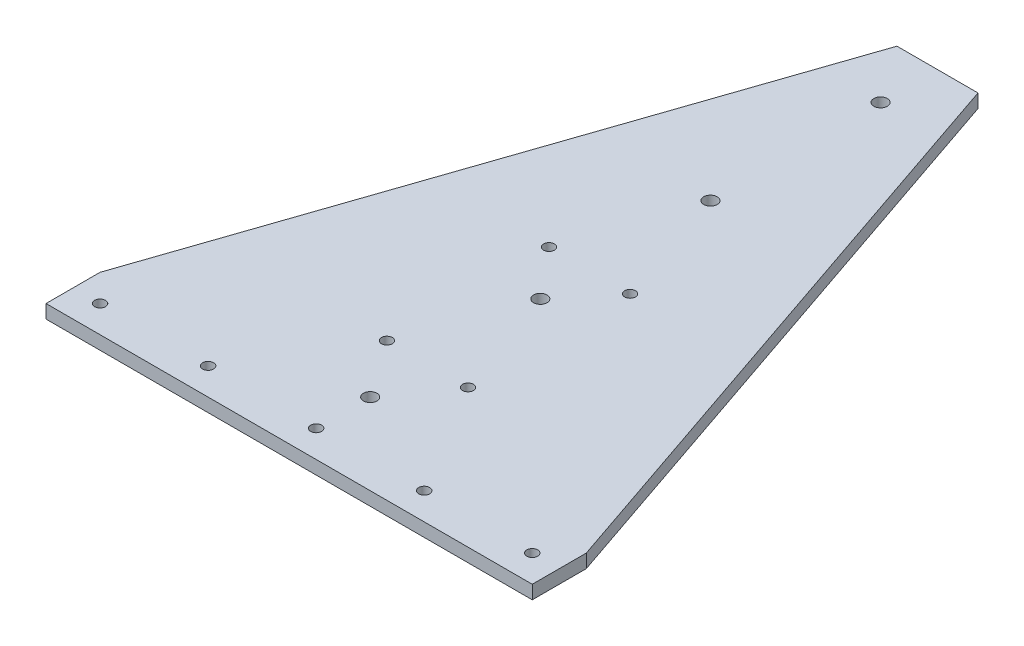
ISO-10303-21;
HEADER;
FILE_DESCRIPTION(('STEP AP214'),'2;1');
FILE_NAME('part.step','',(''),(''),'','','');
FILE_SCHEMA(('AUTOMOTIVE_DESIGN { 1 0 10303 214 1 1 1 1 }'));
ENDSEC;
DATA;
#1=APPLICATION_CONTEXT('core data for automotive mechanical design processes');
#2=APPLICATION_PROTOCOL_DEFINITION('international standard','automotive_design',2000,#1);
#3=PRODUCT_CONTEXT('',#1,'mechanical');
#4=PRODUCT('Part','Part','',(#3));
#5=PRODUCT_RELATED_PRODUCT_CATEGORY('part','',(#4));
#6=PRODUCT_DEFINITION_FORMATION('','',#4);
#7=PRODUCT_DEFINITION_CONTEXT('part definition',#1,'design');
#8=PRODUCT_DEFINITION('design','',#6,#7);
#9=PRODUCT_DEFINITION_SHAPE('','',#8);
#10=(LENGTH_UNIT() NAMED_UNIT(*) SI_UNIT(.MILLI.,.METRE.));
#11=(NAMED_UNIT(*) PLANE_ANGLE_UNIT() SI_UNIT($,.RADIAN.));
#12=(NAMED_UNIT(*) SI_UNIT($,.STERADIAN.) SOLID_ANGLE_UNIT());
#13=UNCERTAINTY_MEASURE_WITH_UNIT(LENGTH_MEASURE(1.E-05),#10,'distance_accuracy_value','');
#14=(GEOMETRIC_REPRESENTATION_CONTEXT(3) GLOBAL_UNCERTAINTY_ASSIGNED_CONTEXT((#13)) GLOBAL_UNIT_ASSIGNED_CONTEXT((#10,
#11,#12)) REPRESENTATION_CONTEXT('',''));
#15=CARTESIAN_POINT('',(0.,0.,0.));
#16=DIRECTION('',(0.,0.,1.));
#17=DIRECTION('',(1.,0.,0.));
#18=AXIS2_PLACEMENT_3D('',#15,#16,#17);
#19=CARTESIAN_POINT('',(0.,6.35,0.));
#20=DIRECTION('',(1.,0.,0.));
#21=DIRECTION('',(0.,0.,-1.));
#22=AXIS2_PLACEMENT_3D('',#19,#20,#21);
#23=PLANE('',#22);
#24=DIRECTION('',(0.,0.,1.));
#25=VECTOR('',#24,1.);
#26=CARTESIAN_POINT('',(0.,0.,0.));
#27=LINE('',#26,#25);
#28=CARTESIAN_POINT('',(0.,0.,-25.4));
#29=VERTEX_POINT('',#28);
#30=CARTESIAN_POINT('',(0.,0.,0.));
#31=VERTEX_POINT('',#30);
#32=EDGE_CURVE('E120',#29,#31,#27,.T.);
#33=ORIENTED_EDGE('',*,*,#32,.T.);
#34=DIRECTION('',(0.,-1.,0.));
#35=VECTOR('',#34,1.);
#36=CARTESIAN_POINT('',(0.,6.35,0.));
#37=LINE('',#36,#35);
#38=CARTESIAN_POINT('',(0.,6.35,0.));
#39=VERTEX_POINT('',#38);
#40=EDGE_CURVE('E11',#39,#31,#37,.T.);
#41=ORIENTED_EDGE('',*,*,#40,.F.);
#42=DIRECTION('',(0.,0.,1.));
#43=VECTOR('',#42,1.);
#44=CARTESIAN_POINT('',(0.,6.35,0.));
#45=LINE('',#44,#43);
#46=CARTESIAN_POINT('',(0.,6.35,-25.4));
#47=VERTEX_POINT('',#46);
#48=EDGE_CURVE('E131',#47,#39,#45,.T.);
#49=ORIENTED_EDGE('',*,*,#48,.F.);
#50=DIRECTION('',(0.,-1.,0.));
#51=VECTOR('',#50,1.);
#52=CARTESIAN_POINT('',(0.,6.35,-25.4));
#53=LINE('',#52,#51);
#54=EDGE_CURVE('E116',#47,#29,#53,.T.);
#55=ORIENTED_EDGE('',*,*,#54,.T.);
#56=EDGE_LOOP('',(#33,#41,#49,#55));
#57=FACE_BOUND('',#56,.T.);
#58=ADVANCED_FACE('F34',(#57),#23,.F.);
#59=CARTESIAN_POINT('',(0.,6.35,0.));
#60=DIRECTION('',(0.,0.,-1.));
#61=DIRECTION('',(-1.,0.,0.));
#62=AXIS2_PLACEMENT_3D('',#59,#60,#61);
#63=PLANE('',#62);
#64=DIRECTION('',(1.,0.,0.));
#65=VECTOR('',#64,1.);
#66=CARTESIAN_POINT('',(0.,0.,0.));
#67=LINE('',#66,#65);
#68=CARTESIAN_POINT('',(228.6,0.,0.));
#69=VERTEX_POINT('',#68);
#70=EDGE_CURVE('E123',#31,#69,#67,.T.);
#71=ORIENTED_EDGE('',*,*,#70,.T.);
#72=DIRECTION('',(0.,-1.,0.));
#73=VECTOR('',#72,1.);
#74=CARTESIAN_POINT('',(228.6,6.35,0.));
#75=LINE('',#74,#73);
#76=CARTESIAN_POINT('',(228.6,6.35,0.));
#77=VERTEX_POINT('',#76);
#78=EDGE_CURVE('E43',#77,#69,#75,.T.);
#79=ORIENTED_EDGE('',*,*,#78,.F.);
#80=DIRECTION('',(1.,0.,0.));
#81=VECTOR('',#80,1.);
#82=CARTESIAN_POINT('',(0.,6.35,0.));
#83=LINE('',#82,#81);
#84=EDGE_CURVE('E89',#39,#77,#83,.T.);
#85=ORIENTED_EDGE('',*,*,#84,.F.);
#86=ORIENTED_EDGE('',*,*,#40,.T.);
#87=EDGE_LOOP('',(#71,#79,#85,#86));
#88=FACE_BOUND('',#87,.T.);
#89=ADVANCED_FACE('F217',(#88),#63,.F.);
#90=CARTESIAN_POINT('',(228.6,6.35,0.));
#91=DIRECTION('',(-1.,0.,0.));
#92=DIRECTION('',(0.,0.,1.));
#93=AXIS2_PLACEMENT_3D('',#90,#91,#92);
#94=PLANE('',#93);
#95=DIRECTION('',(0.,0.,-1.));
#96=VECTOR('',#95,1.);
#97=CARTESIAN_POINT('',(228.6,0.,0.));
#98=LINE('',#97,#96);
#99=CARTESIAN_POINT('',(228.6,0.,-25.4));
#100=VERTEX_POINT('',#99);
#101=EDGE_CURVE('E126',#69,#100,#98,.T.);
#102=ORIENTED_EDGE('',*,*,#101,.T.);
#103=DIRECTION('',(0.,-1.,0.));
#104=VECTOR('',#103,1.);
#105=CARTESIAN_POINT('',(228.6,6.35,-25.4));
#106=LINE('',#105,#104);
#107=CARTESIAN_POINT('',(228.6,6.35,-25.4));
#108=VERTEX_POINT('',#107);
#109=EDGE_CURVE('E111',#108,#100,#106,.T.);
#110=ORIENTED_EDGE('',*,*,#109,.F.);
#111=DIRECTION('',(0.,0.,-1.));
#112=VECTOR('',#111,1.);
#113=CARTESIAN_POINT('',(228.6,6.35,0.));
#114=LINE('',#113,#112);
#115=EDGE_CURVE('E102',#77,#108,#114,.T.);
#116=ORIENTED_EDGE('',*,*,#115,.F.);
#117=ORIENTED_EDGE('',*,*,#78,.T.);
#118=EDGE_LOOP('',(#102,#110,#116,#117));
#119=FACE_BOUND('',#118,.T.);
#120=ADVANCED_FACE('F220',(#119),#94,.F.);
#121=CARTESIAN_POINT('',(133.35,6.35,-304.8));
#122=DIRECTION('',(-0.94651018817854,0.,0.322673927788139));
#123=DIRECTION('',(0.322673927788139,0.,0.94651018817854));
#124=AXIS2_PLACEMENT_3D('',#121,#122,#123);
#125=PLANE('',#124);
#126=DIRECTION('',(-0.322673927788139,0.,-0.94651018817854));
#127=VECTOR('',#126,1.);
#128=CARTESIAN_POINT('',(133.35,0.,-304.8));
#129=LINE('',#128,#127);
#130=CARTESIAN_POINT('',(133.35,0.,-304.8));
#131=VERTEX_POINT('',#130);
#132=EDGE_CURVE('E110',#100,#131,#129,.T.);
#133=ORIENTED_EDGE('',*,*,#132,.T.);
#134=DIRECTION('',(0.,-1.,0.));
#135=VECTOR('',#134,1.);
#136=CARTESIAN_POINT('',(133.35,6.35,-304.8));
#137=LINE('',#136,#135);
#138=CARTESIAN_POINT('',(133.35,6.35,-304.8));
#139=VERTEX_POINT('',#138);
#140=EDGE_CURVE('E107',#139,#131,#137,.T.);
#141=ORIENTED_EDGE('',*,*,#140,.F.);
#142=DIRECTION('',(-0.322673927788139,0.,-0.94651018817854));
#143=VECTOR('',#142,1.);
#144=CARTESIAN_POINT('',(133.35,6.35,-304.8));
#145=LINE('',#144,#143);
#146=EDGE_CURVE('E96',#108,#139,#145,.T.);
#147=ORIENTED_EDGE('',*,*,#146,.F.);
#148=ORIENTED_EDGE('',*,*,#109,.T.);
#149=EDGE_LOOP('',(#133,#141,#147,#148));
#150=FACE_BOUND('',#149,.T.);
#151=ADVANCED_FACE('F108',(#150),#125,.F.);
#152=CARTESIAN_POINT('',(95.25,6.35,-304.8));
#153=DIRECTION('',(0.,0.,1.));
#154=DIRECTION('',(1.,0.,0.));
#155=AXIS2_PLACEMENT_3D('',#152,#153,#154);
#156=PLANE('',#155);
#157=DIRECTION('',(-1.,0.,0.));
#158=VECTOR('',#157,1.);
#159=CARTESIAN_POINT('',(95.25,0.,-304.8));
#160=LINE('',#159,#158);
#161=CARTESIAN_POINT('',(95.25,0.,-304.8));
#162=VERTEX_POINT('',#161);
#163=EDGE_CURVE('E75',#131,#162,#160,.T.);
#164=ORIENTED_EDGE('',*,*,#163,.T.);
#165=DIRECTION('',(0.,-1.,0.));
#166=VECTOR('',#165,1.);
#167=CARTESIAN_POINT('',(95.25,6.35,-304.8));
#168=LINE('',#167,#166);
#169=CARTESIAN_POINT('',(95.25,6.35,-304.8));
#170=VERTEX_POINT('',#169);
#171=EDGE_CURVE('E112',#170,#162,#168,.T.);
#172=ORIENTED_EDGE('',*,*,#171,.F.);
#173=DIRECTION('',(-1.,0.,0.));
#174=VECTOR('',#173,1.);
#175=CARTESIAN_POINT('',(95.25,6.35,-304.8));
#176=LINE('',#175,#174);
#177=EDGE_CURVE('E100',#139,#170,#176,.T.);
#178=ORIENTED_EDGE('',*,*,#177,.F.);
#179=ORIENTED_EDGE('',*,*,#140,.T.);
#180=EDGE_LOOP('',(#164,#172,#178,#179));
#181=FACE_BOUND('',#180,.T.);
#182=ADVANCED_FACE('F114',(#181),#156,.F.);
#183=CARTESIAN_POINT('',(95.25,6.35,-304.8));
#184=DIRECTION('',(0.94651018817854,0.,0.322673927788139));
#185=DIRECTION('',(0.322673927788139,0.,-0.94651018817854));
#186=AXIS2_PLACEMENT_3D('',#183,#184,#185);
#187=PLANE('',#186);
#188=DIRECTION('',(-0.322673927788139,0.,0.94651018817854));
#189=VECTOR('',#188,1.);
#190=CARTESIAN_POINT('',(95.25,0.,-304.8));
#191=LINE('',#190,#189);
#192=EDGE_CURVE('E81',#162,#29,#191,.T.);
#193=ORIENTED_EDGE('',*,*,#192,.T.);
#194=ORIENTED_EDGE('',*,*,#54,.F.);
#195=DIRECTION('',(-0.322673927788139,0.,0.94651018817854));
#196=VECTOR('',#195,1.);
#197=CARTESIAN_POINT('',(95.25,6.35,-304.8));
#198=LINE('',#197,#196);
#199=EDGE_CURVE('E52',#170,#47,#198,.T.);
#200=ORIENTED_EDGE('',*,*,#199,.F.);
#201=ORIENTED_EDGE('',*,*,#171,.T.);
#202=EDGE_LOOP('',(#193,#194,#200,#201));
#203=FACE_BOUND('',#202,.T.);
#204=ADVANCED_FACE('F225',(#203),#187,.F.);
#205=CARTESIAN_POINT('',(0.,6.35,0.));
#206=DIRECTION('',(0.,-1.,0.));
#207=DIRECTION('',(0.,0.,-1.));
#208=AXIS2_PLACEMENT_3D('',#205,#206,#207);
#209=PLANE('',#208);
#210=CARTESIAN_POINT('',(95.25,6.35,-141.224));
#211=DIRECTION('',(0.,1.,0.));
#212=DIRECTION('',(0.,0.,1.));
#213=AXIS2_PLACEMENT_3D('',#210,#211,#212);
#214=CIRCLE('',#213,2.55269999999999);
#215=CARTESIAN_POINT('',(95.25,6.35,-138.6713));
#216=VERTEX_POINT('',#215);
#217=EDGE_CURVE('E157',#216,#216,#214,.T.);
#218=ORIENTED_EDGE('',*,*,#217,.F.);
#219=EDGE_LOOP('',(#218));
#220=FACE_BOUND('',#219,.T.);
#221=CARTESIAN_POINT('',(133.35,6.35,-141.224));
#222=DIRECTION('',(0.,1.,0.));
#223=DIRECTION('',(0.,0.,1.));
#224=AXIS2_PLACEMENT_3D('',#221,#222,#223);
#225=CIRCLE('',#224,2.55269999999999);
#226=CARTESIAN_POINT('',(133.35,6.35,-138.6713));
#227=VERTEX_POINT('',#226);
#228=EDGE_CURVE('E147',#227,#227,#225,.T.);
#229=ORIENTED_EDGE('',*,*,#228,.F.);
#230=EDGE_LOOP('',(#229));
#231=FACE_BOUND('',#230,.T.);
#232=CARTESIAN_POINT('',(133.35,6.35,-65.024));
#233=DIRECTION('',(0.,1.,0.));
#234=DIRECTION('',(0.,0.,1.));
#235=AXIS2_PLACEMENT_3D('',#232,#233,#234);
#236=CIRCLE('',#235,2.55269999999999);
#237=CARTESIAN_POINT('',(133.35,6.35,-62.4713));
#238=VERTEX_POINT('',#237);
#239=EDGE_CURVE('E144',#238,#238,#236,.T.);
#240=ORIENTED_EDGE('',*,*,#239,.F.);
#241=EDGE_LOOP('',(#240));
#242=FACE_BOUND('',#241,.T.);
#243=CARTESIAN_POINT('',(95.25,6.35,-65.024));
#244=DIRECTION('',(0.,1.,0.));
#245=DIRECTION('',(0.,0.,1.));
#246=AXIS2_PLACEMENT_3D('',#243,#244,#245);
#247=CIRCLE('',#246,2.55269999999999);
#248=CARTESIAN_POINT('',(95.25,6.35,-62.4713));
#249=VERTEX_POINT('',#248);
#250=EDGE_CURVE('E141',#249,#249,#247,.T.);
#251=ORIENTED_EDGE('',*,*,#250,.F.);
#252=EDGE_LOOP('',(#251));
#253=FACE_BOUND('',#252,.T.);
#254=CARTESIAN_POINT('',(215.9,6.35,-12.7));
#255=DIRECTION('',(0.,1.,0.));
#256=DIRECTION('',(0.,0.,1.));
#257=AXIS2_PLACEMENT_3D('',#254,#255,#256);
#258=CIRCLE('',#257,2.57968750000001);
#259=CARTESIAN_POINT('',(215.9,6.35,-10.1203125));
#260=VERTEX_POINT('',#259);
#261=EDGE_CURVE('E140',#260,#260,#258,.T.);
#262=ORIENTED_EDGE('',*,*,#261,.F.);
#263=EDGE_LOOP('',(#262));
#264=FACE_BOUND('',#263,.T.);
#265=CARTESIAN_POINT('',(12.7,6.35,-12.7));
#266=DIRECTION('',(0.,1.,0.));
#267=DIRECTION('',(0.,0.,1.));
#268=AXIS2_PLACEMENT_3D('',#265,#266,#267);
#269=CIRCLE('',#268,2.5796875);
#270=CARTESIAN_POINT('',(12.7,6.35,-10.1203125));
#271=VERTEX_POINT('',#270);
#272=EDGE_CURVE('E178',#271,#271,#269,.T.);
#273=ORIENTED_EDGE('',*,*,#272,.F.);
#274=EDGE_LOOP('',(#273));
#275=FACE_BOUND('',#274,.T.);
#276=CARTESIAN_POINT('',(114.3,6.35,-278.0538));
#277=DIRECTION('',(0.,1.,0.));
#278=DIRECTION('',(0.,0.,1.));
#279=AXIS2_PLACEMENT_3D('',#276,#277,#278);
#280=CIRCLE('',#279,3.175);
#281=CARTESIAN_POINT('',(114.3,6.35,-274.8788));
#282=VERTEX_POINT('',#281);
#283=EDGE_CURVE('E172',#282,#282,#280,.T.);
#284=ORIENTED_EDGE('',*,*,#283,.F.);
#285=EDGE_LOOP('',(#284));
#286=FACE_BOUND('',#285,.T.);
#287=CARTESIAN_POINT('',(114.3,6.35,-198.0692));
#288=DIRECTION('',(0.,1.,0.));
#289=DIRECTION('',(0.,0.,1.));
#290=AXIS2_PLACEMENT_3D('',#287,#288,#289);
#291=CIRCLE('',#290,3.175);
#292=CARTESIAN_POINT('',(114.3,6.35,-194.8942));
#293=VERTEX_POINT('',#292);
#294=EDGE_CURVE('E166',#293,#293,#291,.T.);
#295=ORIENTED_EDGE('',*,*,#294,.F.);
#296=EDGE_LOOP('',(#295));
#297=FACE_BOUND('',#296,.T.);
#298=CARTESIAN_POINT('',(114.3,6.35,-118.0846));
#299=DIRECTION('',(0.,1.,0.));
#300=DIRECTION('',(0.,0.,1.));
#301=AXIS2_PLACEMENT_3D('',#298,#299,#300);
#302=CIRCLE('',#301,3.175);
#303=CARTESIAN_POINT('',(114.3,6.35,-114.9096));
#304=VERTEX_POINT('',#303);
#305=EDGE_CURVE('E165',#304,#304,#302,.T.);
#306=ORIENTED_EDGE('',*,*,#305,.F.);
#307=EDGE_LOOP('',(#306));
#308=FACE_BOUND('',#307,.T.);
#309=CARTESIAN_POINT('',(114.3,6.35,-38.1));
#310=DIRECTION('',(0.,1.,0.));
#311=DIRECTION('',(0.,0.,1.));
#312=AXIS2_PLACEMENT_3D('',#309,#310,#311);
#313=CIRCLE('',#312,3.175);
#314=CARTESIAN_POINT('',(114.3,6.35,-34.925));
#315=VERTEX_POINT('',#314);
#316=EDGE_CURVE('E202',#315,#315,#313,.T.);
#317=ORIENTED_EDGE('',*,*,#316,.F.);
#318=EDGE_LOOP('',(#317));
#319=FACE_BOUND('',#318,.T.);
#320=CARTESIAN_POINT('',(63.5,6.35,-12.7));
#321=DIRECTION('',(0.,1.,0.));
#322=DIRECTION('',(0.,0.,1.));
#323=AXIS2_PLACEMENT_3D('',#320,#321,#322);
#324=CIRCLE('',#323,2.57968750000001);
#325=CARTESIAN_POINT('',(63.5,6.35,-10.1203125));
#326=VERTEX_POINT('',#325);
#327=EDGE_CURVE('E196',#326,#326,#324,.T.);
#328=ORIENTED_EDGE('',*,*,#327,.F.);
#329=EDGE_LOOP('',(#328));
#330=FACE_BOUND('',#329,.T.);
#331=CARTESIAN_POINT('',(114.3,6.35,-12.7));
#332=DIRECTION('',(0.,1.,0.));
#333=DIRECTION('',(0.,0.,1.));
#334=AXIS2_PLACEMENT_3D('',#331,#332,#333);
#335=CIRCLE('',#334,2.57968750000001);
#336=CARTESIAN_POINT('',(114.3,6.35,-10.1203125));
#337=VERTEX_POINT('',#336);
#338=EDGE_CURVE('E190',#337,#337,#335,.T.);
#339=ORIENTED_EDGE('',*,*,#338,.F.);
#340=EDGE_LOOP('',(#339));
#341=FACE_BOUND('',#340,.T.);
#342=CARTESIAN_POINT('',(165.1,6.35,-12.7));
#343=DIRECTION('',(0.,1.,0.));
#344=DIRECTION('',(0.,0.,1.));
#345=AXIS2_PLACEMENT_3D('',#342,#343,#344);
#346=CIRCLE('',#345,2.57968750000001);
#347=CARTESIAN_POINT('',(165.1,6.35,-10.1203125));
#348=VERTEX_POINT('',#347);
#349=EDGE_CURVE('E189',#348,#348,#346,.T.);
#350=ORIENTED_EDGE('',*,*,#349,.F.);
#351=EDGE_LOOP('',(#350));
#352=FACE_BOUND('',#351,.T.);
#353=ORIENTED_EDGE('',*,*,#48,.T.);
#354=ORIENTED_EDGE('',*,*,#84,.T.);
#355=ORIENTED_EDGE('',*,*,#115,.T.);
#356=ORIENTED_EDGE('',*,*,#146,.T.);
#357=ORIENTED_EDGE('',*,*,#177,.T.);
#358=ORIENTED_EDGE('',*,*,#199,.T.);
#359=EDGE_LOOP('',(#353,#354,#355,#356,#357,#358));
#360=FACE_BOUND('',#359,.T.);
#361=ADVANCED_FACE('F98',(#220,#231,#242,#253,#264,#275,#286,#297,#308,#319,#330,#341,#352,
#360),#209,.F.);
#362=CARTESIAN_POINT('',(0.,0.,0.));
#363=DIRECTION('',(0.,-1.,0.));
#364=DIRECTION('',(0.,0.,-1.));
#365=AXIS2_PLACEMENT_3D('',#362,#363,#364);
#366=PLANE('',#365);
#367=CARTESIAN_POINT('',(95.25,0.,-141.224));
#368=DIRECTION('',(0.,-1.,0.));
#369=DIRECTION('',(0.,0.,-1.));
#370=AXIS2_PLACEMENT_3D('',#367,#368,#369);
#371=CIRCLE('',#370,2.55269999999999);
#372=CARTESIAN_POINT('',(95.25,0.,-143.7767));
#373=VERTEX_POINT('',#372);
#374=EDGE_CURVE('E37',#373,#373,#371,.T.);
#375=ORIENTED_EDGE('',*,*,#374,.F.);
#376=EDGE_LOOP('',(#375));
#377=FACE_BOUND('',#376,.T.);
#378=CARTESIAN_POINT('',(133.35,0.,-141.224));
#379=DIRECTION('',(0.,-1.,0.));
#380=DIRECTION('',(0.,0.,-1.));
#381=AXIS2_PLACEMENT_3D('',#378,#379,#380);
#382=CIRCLE('',#381,2.55269999999999);
#383=CARTESIAN_POINT('',(133.35,0.,-143.7767));
#384=VERTEX_POINT('',#383);
#385=EDGE_CURVE('E145',#384,#384,#382,.T.);
#386=ORIENTED_EDGE('',*,*,#385,.F.);
#387=EDGE_LOOP('',(#386));
#388=FACE_BOUND('',#387,.T.);
#389=CARTESIAN_POINT('',(133.35,0.,-65.024));
#390=DIRECTION('',(0.,-1.,0.));
#391=DIRECTION('',(0.,0.,-1.));
#392=AXIS2_PLACEMENT_3D('',#389,#390,#391);
#393=CIRCLE('',#392,2.55269999999999);
#394=CARTESIAN_POINT('',(133.35,0.,-67.5767));
#395=VERTEX_POINT('',#394);
#396=EDGE_CURVE('E142',#395,#395,#393,.T.);
#397=ORIENTED_EDGE('',*,*,#396,.F.);
#398=EDGE_LOOP('',(#397));
#399=FACE_BOUND('',#398,.T.);
#400=CARTESIAN_POINT('',(95.25,0.,-65.024));
#401=DIRECTION('',(0.,-1.,0.));
#402=DIRECTION('',(0.,0.,-1.));
#403=AXIS2_PLACEMENT_3D('',#400,#401,#402);
#404=CIRCLE('',#403,2.55269999999999);
#405=CARTESIAN_POINT('',(95.25,0.,-67.5767));
#406=VERTEX_POINT('',#405);
#407=EDGE_CURVE('E137',#406,#406,#404,.T.);
#408=ORIENTED_EDGE('',*,*,#407,.F.);
#409=EDGE_LOOP('',(#408));
#410=FACE_BOUND('',#409,.T.);
#411=CARTESIAN_POINT('',(215.9,0.,-12.7));
#412=DIRECTION('',(0.,1.,0.));
#413=DIRECTION('',(0.,0.,1.));
#414=AXIS2_PLACEMENT_3D('',#411,#412,#413);
#415=CIRCLE('',#414,2.57968750000001);
#416=CARTESIAN_POINT('',(215.9,0.,-10.1203125));
#417=VERTEX_POINT('',#416);
#418=EDGE_CURVE('E181',#417,#417,#415,.T.);
#419=ORIENTED_EDGE('',*,*,#418,.T.);
#420=EDGE_LOOP('',(#419));
#421=FACE_BOUND('',#420,.T.);
#422=CARTESIAN_POINT('',(12.7,0.,-12.7));
#423=DIRECTION('',(0.,1.,0.));
#424=DIRECTION('',(0.,0.,1.));
#425=AXIS2_PLACEMENT_3D('',#422,#423,#424);
#426=CIRCLE('',#425,2.5796875);
#427=CARTESIAN_POINT('',(12.7,0.,-10.1203125));
#428=VERTEX_POINT('',#427);
#429=EDGE_CURVE('E175',#428,#428,#426,.T.);
#430=ORIENTED_EDGE('',*,*,#429,.T.);
#431=EDGE_LOOP('',(#430));
#432=FACE_BOUND('',#431,.T.);
#433=CARTESIAN_POINT('',(114.3,0.,-278.0538));
#434=DIRECTION('',(0.,1.,0.));
#435=DIRECTION('',(0.,0.,1.));
#436=AXIS2_PLACEMENT_3D('',#433,#434,#435);
#437=CIRCLE('',#436,3.175);
#438=CARTESIAN_POINT('',(114.3,0.,-274.8788));
#439=VERTEX_POINT('',#438);
#440=EDGE_CURVE('E169',#439,#439,#437,.T.);
#441=ORIENTED_EDGE('',*,*,#440,.T.);
#442=EDGE_LOOP('',(#441));
#443=FACE_BOUND('',#442,.T.);
#444=CARTESIAN_POINT('',(114.3,0.,-198.0692));
#445=DIRECTION('',(0.,1.,0.));
#446=DIRECTION('',(0.,0.,1.));
#447=AXIS2_PLACEMENT_3D('',#444,#445,#446);
#448=CIRCLE('',#447,3.175);
#449=CARTESIAN_POINT('',(114.3,0.,-194.8942));
#450=VERTEX_POINT('',#449);
#451=EDGE_CURVE('E162',#450,#450,#448,.T.);
#452=ORIENTED_EDGE('',*,*,#451,.T.);
#453=EDGE_LOOP('',(#452));
#454=FACE_BOUND('',#453,.T.);
#455=CARTESIAN_POINT('',(114.3,0.,-118.0846));
#456=DIRECTION('',(0.,1.,0.));
#457=DIRECTION('',(0.,0.,1.));
#458=AXIS2_PLACEMENT_3D('',#455,#456,#457);
#459=CIRCLE('',#458,3.175);
#460=CARTESIAN_POINT('',(114.3,0.,-114.9096));
#461=VERTEX_POINT('',#460);
#462=EDGE_CURVE('E205',#461,#461,#459,.T.);
#463=ORIENTED_EDGE('',*,*,#462,.T.);
#464=EDGE_LOOP('',(#463));
#465=FACE_BOUND('',#464,.T.);
#466=CARTESIAN_POINT('',(114.3,0.,-38.1));
#467=DIRECTION('',(0.,1.,0.));
#468=DIRECTION('',(0.,0.,1.));
#469=AXIS2_PLACEMENT_3D('',#466,#467,#468);
#470=CIRCLE('',#469,3.175);
#471=CARTESIAN_POINT('',(114.3,0.,-34.925));
#472=VERTEX_POINT('',#471);
#473=EDGE_CURVE('E199',#472,#472,#470,.T.);
#474=ORIENTED_EDGE('',*,*,#473,.T.);
#475=EDGE_LOOP('',(#474));
#476=FACE_BOUND('',#475,.T.);
#477=CARTESIAN_POINT('',(63.5,0.,-12.7));
#478=DIRECTION('',(0.,1.,0.));
#479=DIRECTION('',(0.,0.,1.));
#480=AXIS2_PLACEMENT_3D('',#477,#478,#479);
#481=CIRCLE('',#480,2.57968750000001);
#482=CARTESIAN_POINT('',(63.5,0.,-10.1203125));
#483=VERTEX_POINT('',#482);
#484=EDGE_CURVE('E193',#483,#483,#481,.T.);
#485=ORIENTED_EDGE('',*,*,#484,.T.);
#486=EDGE_LOOP('',(#485));
#487=FACE_BOUND('',#486,.T.);
#488=CARTESIAN_POINT('',(114.3,0.,-12.7));
#489=DIRECTION('',(0.,1.,0.));
#490=DIRECTION('',(0.,0.,1.));
#491=AXIS2_PLACEMENT_3D('',#488,#489,#490);
#492=CIRCLE('',#491,2.57968750000001);
#493=CARTESIAN_POINT('',(114.3,0.,-10.1203125));
#494=VERTEX_POINT('',#493);
#495=EDGE_CURVE('E186',#494,#494,#492,.T.);
#496=ORIENTED_EDGE('',*,*,#495,.T.);
#497=EDGE_LOOP('',(#496));
#498=FACE_BOUND('',#497,.T.);
#499=CARTESIAN_POINT('',(165.1,0.,-12.7));
#500=DIRECTION('',(0.,1.,0.));
#501=DIRECTION('',(0.,0.,1.));
#502=AXIS2_PLACEMENT_3D('',#499,#500,#501);
#503=CIRCLE('',#502,2.57968750000001);
#504=CARTESIAN_POINT('',(165.1,0.,-10.1203125));
#505=VERTEX_POINT('',#504);
#506=EDGE_CURVE('E124',#505,#505,#503,.T.);
#507=ORIENTED_EDGE('',*,*,#506,.T.);
#508=EDGE_LOOP('',(#507));
#509=FACE_BOUND('',#508,.T.);
#510=ORIENTED_EDGE('',*,*,#32,.F.);
#511=ORIENTED_EDGE('',*,*,#192,.F.);
#512=ORIENTED_EDGE('',*,*,#163,.F.);
#513=ORIENTED_EDGE('',*,*,#132,.F.);
#514=ORIENTED_EDGE('',*,*,#101,.F.);
#515=ORIENTED_EDGE('',*,*,#70,.F.);
#516=EDGE_LOOP('',(#510,#511,#512,#513,#514,#515));
#517=FACE_BOUND('',#516,.T.);
#518=ADVANCED_FACE('F223',(#377,#388,#399,#410,#421,#432,#443,#454,#465,#476,#487,#498,#509,
#517),#366,.T.);
#519=CARTESIAN_POINT('',(165.1,0.,-12.7));
#520=DIRECTION('',(0.,1.,0.));
#521=DIRECTION('',(0.,0.,1.));
#522=AXIS2_PLACEMENT_3D('',#519,#520,#521);
#523=CYLINDRICAL_SURFACE('',#522,2.57968750000001);
#524=ORIENTED_EDGE('',*,*,#506,.F.);
#525=EDGE_LOOP('',(#524));
#526=FACE_BOUND('',#525,.T.);
#527=ORIENTED_EDGE('',*,*,#349,.T.);
#528=EDGE_LOOP('',(#527));
#529=FACE_BOUND('',#528,.T.);
#530=ADVANCED_FACE('F264',(#526,#529),#523,.F.);
#531=CARTESIAN_POINT('',(114.3,0.,-12.7));
#532=DIRECTION('',(0.,1.,0.));
#533=DIRECTION('',(0.,0.,1.));
#534=AXIS2_PLACEMENT_3D('',#531,#532,#533);
#535=CYLINDRICAL_SURFACE('',#534,2.57968750000001);
#536=ORIENTED_EDGE('',*,*,#495,.F.);
#537=EDGE_LOOP('',(#536));
#538=FACE_BOUND('',#537,.T.);
#539=ORIENTED_EDGE('',*,*,#338,.T.);
#540=EDGE_LOOP('',(#539));
#541=FACE_BOUND('',#540,.T.);
#542=ADVANCED_FACE('F269',(#538,#541),#535,.F.);
#543=CARTESIAN_POINT('',(63.5,0.,-12.7));
#544=DIRECTION('',(0.,1.,0.));
#545=DIRECTION('',(0.,0.,1.));
#546=AXIS2_PLACEMENT_3D('',#543,#544,#545);
#547=CYLINDRICAL_SURFACE('',#546,2.57968750000001);
#548=ORIENTED_EDGE('',*,*,#484,.F.);
#549=EDGE_LOOP('',(#548));
#550=FACE_BOUND('',#549,.T.);
#551=ORIENTED_EDGE('',*,*,#327,.T.);
#552=EDGE_LOOP('',(#551));
#553=FACE_BOUND('',#552,.T.);
#554=ADVANCED_FACE('F281',(#550,#553),#547,.F.);
#555=CARTESIAN_POINT('',(114.3,0.,-38.1));
#556=DIRECTION('',(0.,1.,0.));
#557=DIRECTION('',(0.,0.,1.));
#558=AXIS2_PLACEMENT_3D('',#555,#556,#557);
#559=CYLINDRICAL_SURFACE('',#558,3.175);
#560=ORIENTED_EDGE('',*,*,#473,.F.);
#561=EDGE_LOOP('',(#560));
#562=FACE_BOUND('',#561,.T.);
#563=ORIENTED_EDGE('',*,*,#316,.T.);
#564=EDGE_LOOP('',(#563));
#565=FACE_BOUND('',#564,.T.);
#566=ADVANCED_FACE('F291',(#562,#565),#559,.F.);
#567=CARTESIAN_POINT('',(114.3,0.,-118.0846));
#568=DIRECTION('',(0.,1.,0.));
#569=DIRECTION('',(0.,0.,1.));
#570=AXIS2_PLACEMENT_3D('',#567,#568,#569);
#571=CYLINDRICAL_SURFACE('',#570,3.175);
#572=ORIENTED_EDGE('',*,*,#462,.F.);
#573=EDGE_LOOP('',(#572));
#574=FACE_BOUND('',#573,.T.);
#575=ORIENTED_EDGE('',*,*,#305,.T.);
#576=EDGE_LOOP('',(#575));
#577=FACE_BOUND('',#576,.T.);
#578=ADVANCED_FACE('F301',(#574,#577),#571,.F.);
#579=CARTESIAN_POINT('',(114.3,0.,-198.0692));
#580=DIRECTION('',(0.,1.,0.));
#581=DIRECTION('',(0.,0.,1.));
#582=AXIS2_PLACEMENT_3D('',#579,#580,#581);
#583=CYLINDRICAL_SURFACE('',#582,3.175);
#584=ORIENTED_EDGE('',*,*,#451,.F.);
#585=EDGE_LOOP('',(#584));
#586=FACE_BOUND('',#585,.T.);
#587=ORIENTED_EDGE('',*,*,#294,.T.);
#588=EDGE_LOOP('',(#587));
#589=FACE_BOUND('',#588,.T.);
#590=ADVANCED_FACE('F311',(#586,#589),#583,.F.);
#591=CARTESIAN_POINT('',(114.3,0.,-278.0538));
#592=DIRECTION('',(0.,1.,0.));
#593=DIRECTION('',(0.,0.,1.));
#594=AXIS2_PLACEMENT_3D('',#591,#592,#593);
#595=CYLINDRICAL_SURFACE('',#594,3.175);
#596=ORIENTED_EDGE('',*,*,#440,.F.);
#597=EDGE_LOOP('',(#596));
#598=FACE_BOUND('',#597,.T.);
#599=ORIENTED_EDGE('',*,*,#283,.T.);
#600=EDGE_LOOP('',(#599));
#601=FACE_BOUND('',#600,.T.);
#602=ADVANCED_FACE('F321',(#598,#601),#595,.F.);
#603=CARTESIAN_POINT('',(12.7,0.,-12.7));
#604=DIRECTION('',(0.,1.,0.));
#605=DIRECTION('',(0.,0.,1.));
#606=AXIS2_PLACEMENT_3D('',#603,#604,#605);
#607=CYLINDRICAL_SURFACE('',#606,2.5796875);
#608=ORIENTED_EDGE('',*,*,#429,.F.);
#609=EDGE_LOOP('',(#608));
#610=FACE_BOUND('',#609,.T.);
#611=ORIENTED_EDGE('',*,*,#272,.T.);
#612=EDGE_LOOP('',(#611));
#613=FACE_BOUND('',#612,.T.);
#614=ADVANCED_FACE('F331',(#610,#613),#607,.F.);
#615=CARTESIAN_POINT('',(215.9,0.,-12.7));
#616=DIRECTION('',(0.,1.,0.));
#617=DIRECTION('',(0.,0.,1.));
#618=AXIS2_PLACEMENT_3D('',#615,#616,#617);
#619=CYLINDRICAL_SURFACE('',#618,2.57968750000001);
#620=ORIENTED_EDGE('',*,*,#418,.F.);
#621=EDGE_LOOP('',(#620));
#622=FACE_BOUND('',#621,.T.);
#623=ORIENTED_EDGE('',*,*,#261,.T.);
#624=EDGE_LOOP('',(#623));
#625=FACE_BOUND('',#624,.T.);
#626=ADVANCED_FACE('F341',(#622,#625),#619,.F.);
#627=CARTESIAN_POINT('',(95.25,6.35,-65.024));
#628=DIRECTION('',(0.,1.,0.));
#629=DIRECTION('',(0.,0.,1.));
#630=AXIS2_PLACEMENT_3D('',#627,#628,#629);
#631=CYLINDRICAL_SURFACE('',#630,2.55269999999999);
#632=ORIENTED_EDGE('',*,*,#407,.T.);
#633=EDGE_LOOP('',(#632));
#634=FACE_BOUND('',#633,.T.);
#635=ORIENTED_EDGE('',*,*,#250,.T.);
#636=EDGE_LOOP('',(#635));
#637=FACE_BOUND('',#636,.T.);
#638=ADVANCED_FACE('F351',(#634,#637),#631,.F.);
#639=CARTESIAN_POINT('',(133.35,6.35,-65.024));
#640=DIRECTION('',(0.,1.,0.));
#641=DIRECTION('',(0.,0.,1.));
#642=AXIS2_PLACEMENT_3D('',#639,#640,#641);
#643=CYLINDRICAL_SURFACE('',#642,2.55269999999999);
#644=ORIENTED_EDGE('',*,*,#396,.T.);
#645=EDGE_LOOP('',(#644));
#646=FACE_BOUND('',#645,.T.);
#647=ORIENTED_EDGE('',*,*,#239,.T.);
#648=EDGE_LOOP('',(#647));
#649=FACE_BOUND('',#648,.T.);
#650=ADVANCED_FACE('F373',(#646,#649),#643,.F.);
#651=CARTESIAN_POINT('',(133.35,6.35,-141.224));
#652=DIRECTION('',(0.,1.,0.));
#653=DIRECTION('',(0.,0.,1.));
#654=AXIS2_PLACEMENT_3D('',#651,#652,#653);
#655=CYLINDRICAL_SURFACE('',#654,2.55269999999999);
#656=ORIENTED_EDGE('',*,*,#385,.T.);
#657=EDGE_LOOP('',(#656));
#658=FACE_BOUND('',#657,.T.);
#659=ORIENTED_EDGE('',*,*,#228,.T.);
#660=EDGE_LOOP('',(#659));
#661=FACE_BOUND('',#660,.T.);
#662=ADVANCED_FACE('F384',(#658,#661),#655,.F.);
#663=CARTESIAN_POINT('',(95.25,6.35,-141.224));
#664=DIRECTION('',(0.,1.,0.));
#665=DIRECTION('',(0.,0.,1.));
#666=AXIS2_PLACEMENT_3D('',#663,#664,#665);
#667=CYLINDRICAL_SURFACE('',#666,2.55269999999999);
#668=ORIENTED_EDGE('',*,*,#374,.T.);
#669=EDGE_LOOP('',(#668));
#670=FACE_BOUND('',#669,.T.);
#671=ORIENTED_EDGE('',*,*,#217,.T.);
#672=EDGE_LOOP('',(#671));
#673=FACE_BOUND('',#672,.T.);
#674=ADVANCED_FACE('F395',(#670,#673),#667,.F.);
#675=CLOSED_SHELL('',(#58,#89,#120,#151,#182,#204,#361,#518,#530,#542,#554,#566,#578,#590,#602,
#614,#626,#638,#650,#662,#674));
#676=MANIFOLD_SOLID_BREP('B2',#675);
#677=ADVANCED_BREP_SHAPE_REPRESENTATION('',(#18,#676),#14);
#678=SHAPE_DEFINITION_REPRESENTATION(#9,#677);
ENDSEC;
END-ISO-10303-21;
